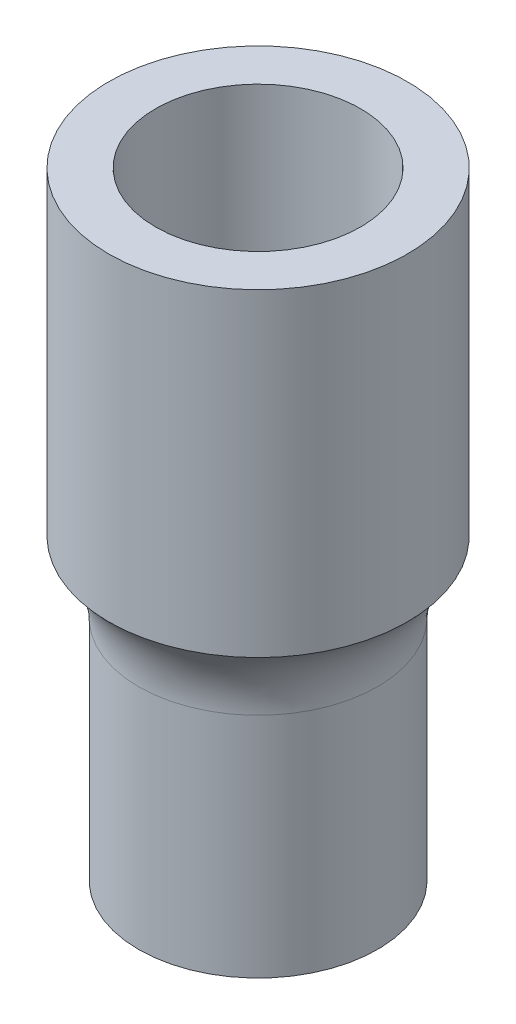
ISO-10303-21;
HEADER;
FILE_DESCRIPTION(('STEP AP214'),'2;1');
FILE_NAME('part.step','',(''),(''),'','','');
FILE_SCHEMA(('AUTOMOTIVE_DESIGN { 1 0 10303 214 1 1 1 1 }'));
ENDSEC;
DATA;
#1=APPLICATION_CONTEXT('core data for automotive mechanical design processes');
#2=APPLICATION_PROTOCOL_DEFINITION('international standard','automotive_design',2000,#1);
#3=PRODUCT_CONTEXT('',#1,'mechanical');
#4=PRODUCT('Part','Part','',(#3));
#5=PRODUCT_RELATED_PRODUCT_CATEGORY('part','',(#4));
#6=PRODUCT_DEFINITION_FORMATION('','',#4);
#7=PRODUCT_DEFINITION_CONTEXT('part definition',#1,'design');
#8=PRODUCT_DEFINITION('design','',#6,#7);
#9=PRODUCT_DEFINITION_SHAPE('','',#8);
#10=(LENGTH_UNIT() NAMED_UNIT(*) SI_UNIT(.MILLI.,.METRE.));
#11=(NAMED_UNIT(*) PLANE_ANGLE_UNIT() SI_UNIT($,.RADIAN.));
#12=(NAMED_UNIT(*) SI_UNIT($,.STERADIAN.) SOLID_ANGLE_UNIT());
#13=UNCERTAINTY_MEASURE_WITH_UNIT(LENGTH_MEASURE(1.E-05),#10,'distance_accuracy_value','');
#14=(GEOMETRIC_REPRESENTATION_CONTEXT(3) GLOBAL_UNCERTAINTY_ASSIGNED_CONTEXT((#13)) GLOBAL_UNIT_ASSIGNED_CONTEXT((#10,
#11,#12)) REPRESENTATION_CONTEXT('',''));
#15=CARTESIAN_POINT('',(0.,0.,0.));
#16=DIRECTION('',(0.,0.,1.));
#17=DIRECTION('',(1.,0.,0.));
#18=AXIS2_PLACEMENT_3D('',#15,#16,#17);
#19=CARTESIAN_POINT('',(0.,0.,0.));
#20=DIRECTION('',(0.,1.,0.));
#21=DIRECTION('',(0.,0.,1.));
#22=AXIS2_PLACEMENT_3D('',#19,#20,#21);
#23=PLANE('',#22);
#24=CARTESIAN_POINT('',(0.,0.,0.));
#25=DIRECTION('',(0.,1.,0.));
#26=DIRECTION('',(0.,0.,1.));
#27=AXIS2_PLACEMENT_3D('',#24,#25,#26);
#28=CIRCLE('',#27,6.);
#29=CARTESIAN_POINT('',(0.,0.,6.));
#30=VERTEX_POINT('',#29);
#31=EDGE_CURVE('E45',#30,#30,#28,.T.);
#32=ORIENTED_EDGE('',*,*,#31,.F.);
#33=EDGE_LOOP('',(#32));
#34=FACE_BOUND('',#33,.T.);
#35=CARTESIAN_POINT('',(0.,0.,0.));
#36=DIRECTION('',(0.,1.,0.));
#37=DIRECTION('',(0.,0.,1.));
#38=AXIS2_PLACEMENT_3D('',#35,#36,#37);
#39=CIRCLE('',#38,4.);
#40=CARTESIAN_POINT('',(0.,0.,4.));
#41=VERTEX_POINT('',#40);
#42=EDGE_CURVE('E50',#41,#41,#39,.T.);
#43=ORIENTED_EDGE('',*,*,#42,.T.);
#44=EDGE_LOOP('',(#43));
#45=FACE_BOUND('',#44,.T.);
#46=ADVANCED_FACE('F37',(#34,#45),#23,.F.);
#47=CARTESIAN_POINT('',(0.,15.,0.));
#48=DIRECTION('',(0.,-1.,0.));
#49=DIRECTION('',(0.,0.,-1.));
#50=AXIS2_PLACEMENT_3D('',#47,#48,#49);
#51=CYLINDRICAL_SURFACE('',#50,6.);
#52=CARTESIAN_POINT('',(0.,11.4292857857286,0.));
#53=DIRECTION('',(0.,1.,0.));
#54=DIRECTION('',(0.,0.,1.));
#55=AXIS2_PLACEMENT_3D('',#52,#53,#54);
#56=CIRCLE('',#55,6.);
#57=CARTESIAN_POINT('',(0.,11.4292857857286,6.));
#58=VERTEX_POINT('',#57);
#59=EDGE_CURVE('E10',#58,#58,#56,.F.);
#60=ORIENTED_EDGE('',*,*,#59,.T.);
#61=EDGE_LOOP('',(#60));
#62=FACE_BOUND('',#61,.T.);
#63=ORIENTED_EDGE('',*,*,#31,.T.);
#64=EDGE_LOOP('',(#63));
#65=FACE_BOUND('',#64,.T.);
#66=ADVANCED_FACE('F104',(#62,#65),#51,.T.);
#67=CARTESIAN_POINT('',(0.,15.,0.));
#68=DIRECTION('',(0.,-1.,0.));
#69=DIRECTION('',(0.,0.,-1.));
#70=AXIS2_PLACEMENT_3D('',#67,#68,#69);
#71=CYLINDRICAL_SURFACE('',#70,4.);
#72=CARTESIAN_POINT('',(0.,15.,0.));
#73=DIRECTION('',(0.,1.,0.));
#74=DIRECTION('',(0.,0.,1.));
#75=AXIS2_PLACEMENT_3D('',#72,#73,#74);
#76=CIRCLE('',#75,4.);
#77=CARTESIAN_POINT('',(0.,15.,4.));
#78=VERTEX_POINT('',#77);
#79=EDGE_CURVE('E55',#78,#78,#76,.T.);
#80=ORIENTED_EDGE('',*,*,#79,.T.);
#81=EDGE_LOOP('',(#80));
#82=FACE_BOUND('',#81,.T.);
#83=ORIENTED_EDGE('',*,*,#42,.F.);
#84=EDGE_LOOP('',(#83));
#85=FACE_BOUND('',#84,.T.);
#86=ADVANCED_FACE('F110',(#82,#85),#71,.F.);
#87=CARTESIAN_POINT('',(0.,15.,0.));
#88=DIRECTION('',(0.,1.,0.));
#89=DIRECTION('',(0.,0.,1.));
#90=AXIS2_PLACEMENT_3D('',#87,#88,#89);
#91=PLANE('',#90);
#92=ORIENTED_EDGE('',*,*,#79,.F.);
#93=EDGE_LOOP('',(#92));
#94=FACE_BOUND('',#93,.T.);
#95=ADVANCED_FACE('F95',(#94),#91,.F.);
#96=CARTESIAN_POINT('',(0.,31.,0.));
#97=DIRECTION('',(0.,-1.,0.));
#98=DIRECTION('',(0.,0.,-1.));
#99=AXIS2_PLACEMENT_3D('',#96,#97,#98);
#100=CYLINDRICAL_SURFACE('',#99,7.49999999999995);
#101=CARTESIAN_POINT('',(0.,31.,0.));
#102=DIRECTION('',(0.,1.,0.));
#103=DIRECTION('',(0.,0.,1.));
#104=AXIS2_PLACEMENT_3D('',#101,#102,#103);
#105=CIRCLE('',#104,7.49999999999995);
#106=CARTESIAN_POINT('',(0.,31.,7.49999999999995));
#107=VERTEX_POINT('',#106);
#108=EDGE_CURVE('E61',#107,#107,#105,.T.);
#109=ORIENTED_EDGE('',*,*,#108,.F.);
#110=EDGE_LOOP('',(#109));
#111=FACE_BOUND('',#110,.T.);
#112=CARTESIAN_POINT('',(0.,15.,0.));
#113=DIRECTION('',(0.,1.,0.));
#114=DIRECTION('',(0.,0.,1.));
#115=AXIS2_PLACEMENT_3D('',#112,#113,#114);
#116=CIRCLE('',#115,7.49999999999995);
#117=CARTESIAN_POINT('',(0.,15.,7.49999999999995));
#118=VERTEX_POINT('',#117);
#119=EDGE_CURVE('E62',#118,#118,#116,.T.);
#120=ORIENTED_EDGE('',*,*,#119,.T.);
#121=EDGE_LOOP('',(#120));
#122=FACE_BOUND('',#121,.T.);
#123=ADVANCED_FACE('F89',(#111,#122),#100,.T.);
#124=CARTESIAN_POINT('',(0.,31.,0.));
#125=DIRECTION('',(0.,1.,0.));
#126=DIRECTION('',(0.,0.,1.));
#127=AXIS2_PLACEMENT_3D('',#124,#125,#126);
#128=PLANE('',#127);
#129=CARTESIAN_POINT('',(0.,31.,0.));
#130=DIRECTION('',(0.,1.,0.));
#131=DIRECTION('',(0.,0.,1.));
#132=AXIS2_PLACEMENT_3D('',#129,#130,#131);
#133=CIRCLE('',#132,5.15);
#134=CARTESIAN_POINT('',(0.,31.,5.15));
#135=VERTEX_POINT('',#134);
#136=EDGE_CURVE('E70',#135,#135,#133,.T.);
#137=ORIENTED_EDGE('',*,*,#136,.F.);
#138=EDGE_LOOP('',(#137));
#139=FACE_BOUND('',#138,.T.);
#140=ORIENTED_EDGE('',*,*,#108,.T.);
#141=EDGE_LOOP('',(#140));
#142=FACE_BOUND('',#141,.T.);
#143=ADVANCED_FACE('F86',(#139,#142),#128,.T.);
#144=CARTESIAN_POINT('',(0.,11.4292857857286,0.));
#145=DIRECTION('',(0.,1.,0.));
#146=DIRECTION('',(0.,0.,1.));
#147=AXIS2_PLACEMENT_3D('',#144,#145,#146);
#148=TOROIDAL_SURFACE('',#147,11.,5.);
#149=ORIENTED_EDGE('',*,*,#59,.F.);
#150=EDGE_LOOP('',(#149));
#151=FACE_BOUND('',#150,.T.);
#152=ORIENTED_EDGE('',*,*,#119,.F.);
#153=EDGE_LOOP('',(#152));
#154=FACE_BOUND('',#153,.T.);
#155=ADVANCED_FACE('F39',(#151,#154),#148,.F.);
#156=CARTESIAN_POINT('',(0.,21.,0.));
#157=DIRECTION('',(0.,1.,0.));
#158=DIRECTION('',(0.,0.,1.));
#159=AXIS2_PLACEMENT_3D('',#156,#157,#158);
#160=CYLINDRICAL_SURFACE('',#159,5.15);
#161=CARTESIAN_POINT('',(0.,21.,0.));
#162=DIRECTION('',(0.,1.,0.));
#163=DIRECTION('',(0.,0.,1.));
#164=AXIS2_PLACEMENT_3D('',#161,#162,#163);
#165=CIRCLE('',#164,5.15);
#166=CARTESIAN_POINT('',(0.,21.,5.15));
#167=VERTEX_POINT('',#166);
#168=EDGE_CURVE('E66',#167,#167,#165,.T.);
#169=ORIENTED_EDGE('',*,*,#168,.F.);
#170=EDGE_LOOP('',(#169));
#171=FACE_BOUND('',#170,.T.);
#172=ORIENTED_EDGE('',*,*,#136,.T.);
#173=EDGE_LOOP('',(#172));
#174=FACE_BOUND('',#173,.T.);
#175=ADVANCED_FACE('F80',(#171,#174),#160,.F.);
#176=CARTESIAN_POINT('',(0.,21.,0.));
#177=DIRECTION('',(0.,1.,0.));
#178=DIRECTION('',(0.,0.,1.));
#179=AXIS2_PLACEMENT_3D('',#176,#177,#178);
#180=PLANE('',#179);
#181=ORIENTED_EDGE('',*,*,#168,.T.);
#182=EDGE_LOOP('',(#181));
#183=FACE_BOUND('',#182,.T.);
#184=ADVANCED_FACE('F78',(#183),#180,.T.);
#185=CLOSED_SHELL('',(#46,#66,#86,#95,#123,#143,#155,#175,#184));
#186=MANIFOLD_SOLID_BREP('B2',#185);
#187=ADVANCED_BREP_SHAPE_REPRESENTATION('',(#18,#186),#14);
#188=SHAPE_DEFINITION_REPRESENTATION(#9,#187);
ENDSEC;
END-ISO-10303-21;
